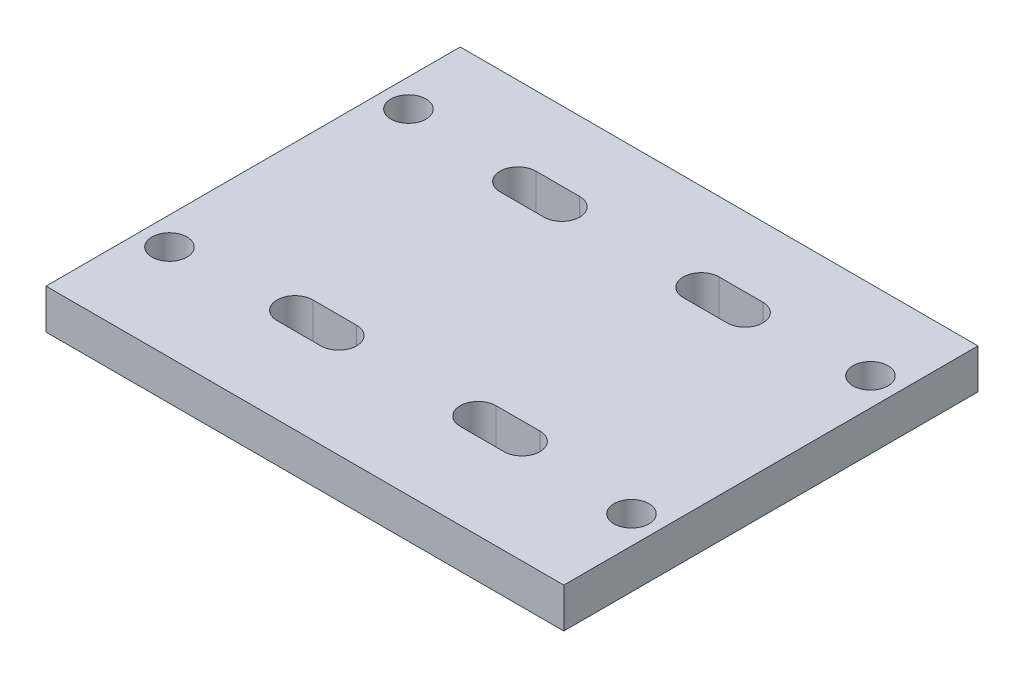
ISO-10303-21;
HEADER;
FILE_DESCRIPTION(('STEP AP214'),'2;1');
FILE_NAME('part.step','',(''),(''),'','','');
FILE_SCHEMA(('AUTOMOTIVE_DESIGN { 1 0 10303 214 1 1 1 1 }'));
ENDSEC;
DATA;
#1=APPLICATION_CONTEXT('core data for automotive mechanical design processes');
#2=APPLICATION_PROTOCOL_DEFINITION('international standard','automotive_design',2000,#1);
#3=PRODUCT_CONTEXT('',#1,'mechanical');
#4=PRODUCT('Part','Part','',(#3));
#5=PRODUCT_RELATED_PRODUCT_CATEGORY('part','',(#4));
#6=PRODUCT_DEFINITION_FORMATION('','',#4);
#7=PRODUCT_DEFINITION_CONTEXT('part definition',#1,'design');
#8=PRODUCT_DEFINITION('design','',#6,#7);
#9=PRODUCT_DEFINITION_SHAPE('','',#8);
#10=(LENGTH_UNIT() NAMED_UNIT(*) SI_UNIT(.MILLI.,.METRE.));
#11=(NAMED_UNIT(*) PLANE_ANGLE_UNIT() SI_UNIT($,.RADIAN.));
#12=(NAMED_UNIT(*) SI_UNIT($,.STERADIAN.) SOLID_ANGLE_UNIT());
#13=UNCERTAINTY_MEASURE_WITH_UNIT(LENGTH_MEASURE(1.E-05),#10,'distance_accuracy_value','');
#14=(GEOMETRIC_REPRESENTATION_CONTEXT(3) GLOBAL_UNCERTAINTY_ASSIGNED_CONTEXT((#13)) GLOBAL_UNIT_ASSIGNED_CONTEXT((#10,
#11,#12)) REPRESENTATION_CONTEXT('',''));
#15=CARTESIAN_POINT('',(0.,0.,0.));
#16=DIRECTION('',(0.,0.,1.));
#17=DIRECTION('',(1.,0.,0.));
#18=AXIS2_PLACEMENT_3D('',#15,#16,#17);
#19=CARTESIAN_POINT('',(0.,5.,0.));
#20=DIRECTION('',(0.,-1.,0.));
#21=DIRECTION('',(0.,0.,-1.));
#22=AXIS2_PLACEMENT_3D('',#19,#20,#21);
#23=PLANE('',#22);
#24=CARTESIAN_POINT('',(8.75,5.,-15.));
#25=DIRECTION('',(0.,1.,0.));
#26=DIRECTION('',(0.,0.,1.));
#27=AXIS2_PLACEMENT_3D('',#24,#25,#26);
#28=CIRCLE('',#27,2.25);
#29=CARTESIAN_POINT('',(8.75,5.,-17.25));
#30=VERTEX_POINT('',#29);
#31=CARTESIAN_POINT('',(8.75,5.,-12.75));
#32=VERTEX_POINT('',#31);
#33=EDGE_CURVE('E209',#30,#32,#28,.T.);
#34=ORIENTED_EDGE('',*,*,#33,.F.);
#35=DIRECTION('',(-1.,0.,0.));
#36=VECTOR('',#35,1.);
#37=CARTESIAN_POINT('',(8.75,5.,-17.25));
#38=LINE('',#37,#36);
#39=CARTESIAN_POINT('',(14.25,5.,-17.25));
#40=VERTEX_POINT('',#39);
#41=EDGE_CURVE('E217',#40,#30,#38,.T.);
#42=ORIENTED_EDGE('',*,*,#41,.F.);
#43=CARTESIAN_POINT('',(14.25,5.,-15.));
#44=DIRECTION('',(0.,1.,0.));
#45=DIRECTION('',(0.,0.,1.));
#46=AXIS2_PLACEMENT_3D('',#43,#44,#45);
#47=CIRCLE('',#46,2.25);
#48=CARTESIAN_POINT('',(14.25,5.,-12.75));
#49=VERTEX_POINT('',#48);
#50=EDGE_CURVE('E214',#49,#40,#47,.T.);
#51=ORIENTED_EDGE('',*,*,#50,.F.);
#52=DIRECTION('',(1.,0.,0.));
#53=VECTOR('',#52,1.);
#54=CARTESIAN_POINT('',(8.75,5.,-12.75));
#55=LINE('',#54,#53);
#56=EDGE_CURVE('E211',#32,#49,#55,.T.);
#57=ORIENTED_EDGE('',*,*,#56,.F.);
#58=EDGE_LOOP('',(#34,#42,#51,#57));
#59=FACE_BOUND('',#58,.T.);
#60=CARTESIAN_POINT('',(-14.25,5.,-15.));
#61=DIRECTION('',(0.,1.,0.));
#62=DIRECTION('',(0.,0.,1.));
#63=AXIS2_PLACEMENT_3D('',#60,#61,#62);
#64=CIRCLE('',#63,2.25);
#65=CARTESIAN_POINT('',(-14.25,5.,-17.25));
#66=VERTEX_POINT('',#65);
#67=CARTESIAN_POINT('',(-14.25,5.,-12.75));
#68=VERTEX_POINT('',#67);
#69=EDGE_CURVE('E271',#66,#68,#64,.T.);
#70=ORIENTED_EDGE('',*,*,#69,.F.);
#71=DIRECTION('',(-1.,0.,0.));
#72=VECTOR('',#71,1.);
#73=CARTESIAN_POINT('',(-14.25,5.,-17.25));
#74=LINE('',#73,#72);
#75=CARTESIAN_POINT('',(-8.75,5.,-17.25));
#76=VERTEX_POINT('',#75);
#77=EDGE_CURVE('E279',#76,#66,#74,.T.);
#78=ORIENTED_EDGE('',*,*,#77,.F.);
#79=CARTESIAN_POINT('',(-8.75,5.,-15.));
#80=DIRECTION('',(0.,1.,0.));
#81=DIRECTION('',(0.,0.,1.));
#82=AXIS2_PLACEMENT_3D('',#79,#80,#81);
#83=CIRCLE('',#82,2.25);
#84=CARTESIAN_POINT('',(-8.75,5.,-12.75));
#85=VERTEX_POINT('',#84);
#86=EDGE_CURVE('E276',#85,#76,#83,.T.);
#87=ORIENTED_EDGE('',*,*,#86,.F.);
#88=DIRECTION('',(1.,0.,0.));
#89=VECTOR('',#88,1.);
#90=CARTESIAN_POINT('',(-14.25,5.,-12.75));
#91=LINE('',#90,#89);
#92=EDGE_CURVE('E273',#68,#85,#91,.T.);
#93=ORIENTED_EDGE('',*,*,#92,.F.);
#94=EDGE_LOOP('',(#70,#78,#87,#93));
#95=FACE_BOUND('',#94,.T.);
#96=DIRECTION('',(0.,0.,-1.));
#97=VECTOR('',#96,1.);
#98=CARTESIAN_POINT('',(32.5,5.,26.));
#99=LINE('',#98,#97);
#100=CARTESIAN_POINT('',(32.5,5.,26.));
#101=VERTEX_POINT('',#100);
#102=CARTESIAN_POINT('',(32.5,5.,-26.));
#103=VERTEX_POINT('',#102);
#104=EDGE_CURVE('E326',#101,#103,#99,.T.);
#105=ORIENTED_EDGE('',*,*,#104,.T.);
#106=DIRECTION('',(-1.,0.,0.));
#107=VECTOR('',#106,1.);
#108=CARTESIAN_POINT('',(-32.5,5.,-26.));
#109=LINE('',#108,#107);
#110=CARTESIAN_POINT('',(-32.5,5.,-26.));
#111=VERTEX_POINT('',#110);
#112=EDGE_CURVE('E329',#103,#111,#109,.T.);
#113=ORIENTED_EDGE('',*,*,#112,.T.);
#114=DIRECTION('',(0.,0.,1.));
#115=VECTOR('',#114,1.);
#116=CARTESIAN_POINT('',(-32.5,5.,26.));
#117=LINE('',#116,#115);
#118=CARTESIAN_POINT('',(-32.5,5.,26.));
#119=VERTEX_POINT('',#118);
#120=EDGE_CURVE('E332',#111,#119,#117,.T.);
#121=ORIENTED_EDGE('',*,*,#120,.T.);
#122=DIRECTION('',(1.,0.,0.));
#123=VECTOR('',#122,1.);
#124=CARTESIAN_POINT('',(-32.5,5.,26.));
#125=LINE('',#124,#123);
#126=EDGE_CURVE('E334',#119,#101,#125,.T.);
#127=ORIENTED_EDGE('',*,*,#126,.T.);
#128=EDGE_LOOP('',(#105,#113,#121,#127));
#129=FACE_BOUND('',#128,.T.);
#130=CARTESIAN_POINT('',(-29.,5.,-16.));
#131=DIRECTION('',(0.,1.,0.));
#132=DIRECTION('',(0.,0.,1.));
#133=AXIS2_PLACEMENT_3D('',#130,#131,#132);
#134=CIRCLE('',#133,2.2);
#135=CARTESIAN_POINT('',(-29.,5.,-13.8));
#136=VERTEX_POINT('',#135);
#137=EDGE_CURVE('E320',#136,#136,#134,.T.);
#138=ORIENTED_EDGE('',*,*,#137,.F.);
#139=EDGE_LOOP('',(#138));
#140=FACE_BOUND('',#139,.T.);
#141=CARTESIAN_POINT('',(-29.,5.,14.));
#142=DIRECTION('',(0.,1.,0.));
#143=DIRECTION('',(0.,0.,1.));
#144=AXIS2_PLACEMENT_3D('',#141,#142,#143);
#145=CIRCLE('',#144,2.2);
#146=CARTESIAN_POINT('',(-29.,5.,16.2));
#147=VERTEX_POINT('',#146);
#148=EDGE_CURVE('E314',#147,#147,#145,.T.);
#149=ORIENTED_EDGE('',*,*,#148,.F.);
#150=EDGE_LOOP('',(#149));
#151=FACE_BOUND('',#150,.T.);
#152=CARTESIAN_POINT('',(29.,5.,14.));
#153=DIRECTION('',(0.,1.,0.));
#154=DIRECTION('',(0.,0.,1.));
#155=AXIS2_PLACEMENT_3D('',#152,#153,#154);
#156=CIRCLE('',#155,2.2);
#157=CARTESIAN_POINT('',(29.,5.,16.2));
#158=VERTEX_POINT('',#157);
#159=EDGE_CURVE('E308',#158,#158,#156,.T.);
#160=ORIENTED_EDGE('',*,*,#159,.F.);
#161=EDGE_LOOP('',(#160));
#162=FACE_BOUND('',#161,.T.);
#163=CARTESIAN_POINT('',(29.,5.,-16.));
#164=DIRECTION('',(0.,1.,0.));
#165=DIRECTION('',(0.,0.,1.));
#166=AXIS2_PLACEMENT_3D('',#163,#164,#165);
#167=CIRCLE('',#166,2.2);
#168=CARTESIAN_POINT('',(29.,5.,-13.8));
#169=VERTEX_POINT('',#168);
#170=EDGE_CURVE('E302',#169,#169,#167,.T.);
#171=ORIENTED_EDGE('',*,*,#170,.F.);
#172=EDGE_LOOP('',(#171));
#173=FACE_BOUND('',#172,.T.);
#174=CARTESIAN_POINT('',(8.75000000000001,5.,13.));
#175=DIRECTION('',(0.,1.,0.));
#176=DIRECTION('',(0.,0.,1.));
#177=AXIS2_PLACEMENT_3D('',#174,#175,#176);
#178=CIRCLE('',#177,2.25);
#179=CARTESIAN_POINT('',(8.75000000000001,5.,10.75));
#180=VERTEX_POINT('',#179);
#181=CARTESIAN_POINT('',(8.75000000000001,5.,15.25));
#182=VERTEX_POINT('',#181);
#183=EDGE_CURVE('E240',#180,#182,#178,.T.);
#184=ORIENTED_EDGE('',*,*,#183,.F.);
#185=DIRECTION('',(-1.,0.,0.));
#186=VECTOR('',#185,1.);
#187=CARTESIAN_POINT('',(8.75000000000001,5.,10.75));
#188=LINE('',#187,#186);
#189=CARTESIAN_POINT('',(14.25,5.,10.75));
#190=VERTEX_POINT('',#189);
#191=EDGE_CURVE('E248',#190,#180,#188,.T.);
#192=ORIENTED_EDGE('',*,*,#191,.F.);
#193=CARTESIAN_POINT('',(14.25,5.,13.));
#194=DIRECTION('',(0.,1.,0.));
#195=DIRECTION('',(0.,0.,1.));
#196=AXIS2_PLACEMENT_3D('',#193,#194,#195);
#197=CIRCLE('',#196,2.25);
#198=CARTESIAN_POINT('',(14.25,5.,15.25));
#199=VERTEX_POINT('',#198);
#200=EDGE_CURVE('E245',#199,#190,#197,.T.);
#201=ORIENTED_EDGE('',*,*,#200,.F.);
#202=DIRECTION('',(1.,0.,0.));
#203=VECTOR('',#202,1.);
#204=CARTESIAN_POINT('',(8.75000000000001,5.,15.25));
#205=LINE('',#204,#203);
#206=EDGE_CURVE('E242',#182,#199,#205,.T.);
#207=ORIENTED_EDGE('',*,*,#206,.F.);
#208=EDGE_LOOP('',(#184,#192,#201,#207));
#209=FACE_BOUND('',#208,.T.);
#210=CARTESIAN_POINT('',(-14.25,5.,13.));
#211=DIRECTION('',(0.,1.,0.));
#212=DIRECTION('',(0.,0.,1.));
#213=AXIS2_PLACEMENT_3D('',#210,#211,#212);
#214=CIRCLE('',#213,2.25);
#215=CARTESIAN_POINT('',(-14.25,5.,10.75));
#216=VERTEX_POINT('',#215);
#217=CARTESIAN_POINT('',(-14.25,5.,15.25));
#218=VERTEX_POINT('',#217);
#219=EDGE_CURVE('E173',#216,#218,#214,.T.);
#220=ORIENTED_EDGE('',*,*,#219,.F.);
#221=DIRECTION('',(-1.,0.,0.));
#222=VECTOR('',#221,1.);
#223=CARTESIAN_POINT('',(-14.25,5.,10.75));
#224=LINE('',#223,#222);
#225=CARTESIAN_POINT('',(-8.75,5.,10.75));
#226=VERTEX_POINT('',#225);
#227=EDGE_CURVE('E195',#226,#216,#224,.T.);
#228=ORIENTED_EDGE('',*,*,#227,.F.);
#229=CARTESIAN_POINT('',(-8.75,5.,13.));
#230=DIRECTION('',(0.,1.,0.));
#231=DIRECTION('',(0.,0.,1.));
#232=AXIS2_PLACEMENT_3D('',#229,#230,#231);
#233=CIRCLE('',#232,2.25);
#234=CARTESIAN_POINT('',(-8.74999999999999,5.,15.25));
#235=VERTEX_POINT('',#234);
#236=EDGE_CURVE('E193',#235,#226,#233,.T.);
#237=ORIENTED_EDGE('',*,*,#236,.F.);
#238=DIRECTION('',(1.,0.,0.));
#239=VECTOR('',#238,1.);
#240=CARTESIAN_POINT('',(-14.25,5.,15.25));
#241=LINE('',#240,#239);
#242=EDGE_CURVE('E181',#218,#235,#241,.T.);
#243=ORIENTED_EDGE('',*,*,#242,.F.);
#244=EDGE_LOOP('',(#220,#228,#237,#243));
#245=FACE_BOUND('',#244,.T.);
#246=ADVANCED_FACE('F36',(#59,#95,#129,#140,#151,#162,#173,#209,#245),#23,.F.);
#247=CARTESIAN_POINT('',(0.,0.,0.));
#248=DIRECTION('',(0.,-1.,0.));
#249=DIRECTION('',(0.,0.,-1.));
#250=AXIS2_PLACEMENT_3D('',#247,#248,#249);
#251=PLANE('',#250);
#252=CARTESIAN_POINT('',(29.,0.,14.));
#253=DIRECTION('',(0.,1.,0.));
#254=DIRECTION('',(0.,0.,1.));
#255=AXIS2_PLACEMENT_3D('',#252,#253,#254);
#256=CIRCLE('',#255,2.2);
#257=CARTESIAN_POINT('',(29.,0.,16.2));
#258=VERTEX_POINT('',#257);
#259=EDGE_CURVE('E305',#258,#258,#256,.T.);
#260=ORIENTED_EDGE('',*,*,#259,.T.);
#261=EDGE_LOOP('',(#260));
#262=FACE_BOUND('',#261,.T.);
#263=CARTESIAN_POINT('',(-29.,0.,-16.));
#264=DIRECTION('',(0.,1.,0.));
#265=DIRECTION('',(0.,0.,1.));
#266=AXIS2_PLACEMENT_3D('',#263,#264,#265);
#267=CIRCLE('',#266,2.2);
#268=CARTESIAN_POINT('',(-29.,0.,-13.8));
#269=VERTEX_POINT('',#268);
#270=EDGE_CURVE('E317',#269,#269,#267,.T.);
#271=ORIENTED_EDGE('',*,*,#270,.T.);
#272=EDGE_LOOP('',(#271));
#273=FACE_BOUND('',#272,.T.);
#274=DIRECTION('',(0.,0.,-1.));
#275=VECTOR('',#274,1.);
#276=CARTESIAN_POINT('',(32.5,0.,26.));
#277=LINE('',#276,#275);
#278=CARTESIAN_POINT('',(32.5,0.,26.));
#279=VERTEX_POINT('',#278);
#280=CARTESIAN_POINT('',(32.5,0.,-26.));
#281=VERTEX_POINT('',#280);
#282=EDGE_CURVE('E323',#279,#281,#277,.T.);
#283=ORIENTED_EDGE('',*,*,#282,.F.);
#284=DIRECTION('',(1.,0.,0.));
#285=VECTOR('',#284,1.);
#286=CARTESIAN_POINT('',(-32.5,0.,26.));
#287=LINE('',#286,#285);
#288=CARTESIAN_POINT('',(-32.5,0.,26.));
#289=VERTEX_POINT('',#288);
#290=EDGE_CURVE('E330',#289,#279,#287,.T.);
#291=ORIENTED_EDGE('',*,*,#290,.F.);
#292=DIRECTION('',(0.,0.,1.));
#293=VECTOR('',#292,1.);
#294=CARTESIAN_POINT('',(-32.5,0.,26.));
#295=LINE('',#294,#293);
#296=CARTESIAN_POINT('',(-32.5,0.,-26.));
#297=VERTEX_POINT('',#296);
#298=EDGE_CURVE('E341',#297,#289,#295,.T.);
#299=ORIENTED_EDGE('',*,*,#298,.F.);
#300=DIRECTION('',(-1.,0.,0.));
#301=VECTOR('',#300,1.);
#302=CARTESIAN_POINT('',(-32.5,0.,-26.));
#303=LINE('',#302,#301);
#304=EDGE_CURVE('E339',#281,#297,#303,.T.);
#305=ORIENTED_EDGE('',*,*,#304,.F.);
#306=EDGE_LOOP('',(#283,#291,#299,#305));
#307=FACE_BOUND('',#306,.T.);
#308=CARTESIAN_POINT('',(-29.,0.,14.));
#309=DIRECTION('',(0.,1.,0.));
#310=DIRECTION('',(0.,0.,1.));
#311=AXIS2_PLACEMENT_3D('',#308,#309,#310);
#312=CIRCLE('',#311,2.2);
#313=CARTESIAN_POINT('',(-29.,0.,16.2));
#314=VERTEX_POINT('',#313);
#315=EDGE_CURVE('E311',#314,#314,#312,.T.);
#316=ORIENTED_EDGE('',*,*,#315,.T.);
#317=EDGE_LOOP('',(#316));
#318=FACE_BOUND('',#317,.T.);
#319=CARTESIAN_POINT('',(29.,0.,-16.));
#320=DIRECTION('',(0.,1.,0.));
#321=DIRECTION('',(0.,0.,1.));
#322=AXIS2_PLACEMENT_3D('',#319,#320,#321);
#323=CIRCLE('',#322,2.2);
#324=CARTESIAN_POINT('',(29.,0.,-13.8));
#325=VERTEX_POINT('',#324);
#326=EDGE_CURVE('E301',#325,#325,#323,.T.);
#327=ORIENTED_EDGE('',*,*,#326,.T.);
#328=EDGE_LOOP('',(#327));
#329=FACE_BOUND('',#328,.T.);
#330=DIRECTION('',(-1.,0.,0.));
#331=VECTOR('',#330,1.);
#332=CARTESIAN_POINT('',(-14.25,0.,-17.25));
#333=LINE('',#332,#331);
#334=CARTESIAN_POINT('',(-8.75,0.,-17.25));
#335=VERTEX_POINT('',#334);
#336=CARTESIAN_POINT('',(-14.25,0.,-17.25));
#337=VERTEX_POINT('',#336);
#338=EDGE_CURVE('E274',#335,#337,#333,.T.);
#339=ORIENTED_EDGE('',*,*,#338,.T.);
#340=CARTESIAN_POINT('',(-14.25,0.,-15.));
#341=DIRECTION('',(0.,1.,0.));
#342=DIRECTION('',(0.,0.,1.));
#343=AXIS2_PLACEMENT_3D('',#340,#341,#342);
#344=CIRCLE('',#343,2.25);
#345=CARTESIAN_POINT('',(-14.25,0.,-12.75));
#346=VERTEX_POINT('',#345);
#347=EDGE_CURVE('E270',#337,#346,#344,.T.);
#348=ORIENTED_EDGE('',*,*,#347,.T.);
#349=DIRECTION('',(1.,0.,0.));
#350=VECTOR('',#349,1.);
#351=CARTESIAN_POINT('',(-14.25,0.,-12.75));
#352=LINE('',#351,#350);
#353=CARTESIAN_POINT('',(-8.75,0.,-12.75));
#354=VERTEX_POINT('',#353);
#355=EDGE_CURVE('E284',#346,#354,#352,.T.);
#356=ORIENTED_EDGE('',*,*,#355,.T.);
#357=CARTESIAN_POINT('',(-8.75,0.,-15.));
#358=DIRECTION('',(0.,1.,0.));
#359=DIRECTION('',(0.,0.,1.));
#360=AXIS2_PLACEMENT_3D('',#357,#358,#359);
#361=CIRCLE('',#360,2.25);
#362=EDGE_CURVE('E287',#354,#335,#361,.T.);
#363=ORIENTED_EDGE('',*,*,#362,.T.);
#364=EDGE_LOOP('',(#339,#348,#356,#363));
#365=FACE_BOUND('',#364,.T.);
#366=DIRECTION('',(-1.,0.,0.));
#367=VECTOR('',#366,1.);
#368=CARTESIAN_POINT('',(8.75000000000001,0.,10.75));
#369=LINE('',#368,#367);
#370=CARTESIAN_POINT('',(14.25,0.,10.75));
#371=VERTEX_POINT('',#370);
#372=CARTESIAN_POINT('',(8.75000000000001,0.,10.75));
#373=VERTEX_POINT('',#372);
#374=EDGE_CURVE('E243',#371,#373,#369,.T.);
#375=ORIENTED_EDGE('',*,*,#374,.T.);
#376=CARTESIAN_POINT('',(8.75000000000001,0.,13.));
#377=DIRECTION('',(0.,1.,0.));
#378=DIRECTION('',(0.,0.,1.));
#379=AXIS2_PLACEMENT_3D('',#376,#377,#378);
#380=CIRCLE('',#379,2.25);
#381=CARTESIAN_POINT('',(8.75000000000001,0.,15.25));
#382=VERTEX_POINT('',#381);
#383=EDGE_CURVE('E239',#373,#382,#380,.T.);
#384=ORIENTED_EDGE('',*,*,#383,.T.);
#385=DIRECTION('',(1.,0.,0.));
#386=VECTOR('',#385,1.);
#387=CARTESIAN_POINT('',(8.75000000000001,0.,15.25));
#388=LINE('',#387,#386);
#389=CARTESIAN_POINT('',(14.25,0.,15.25));
#390=VERTEX_POINT('',#389);
#391=EDGE_CURVE('E253',#382,#390,#388,.T.);
#392=ORIENTED_EDGE('',*,*,#391,.T.);
#393=CARTESIAN_POINT('',(14.25,0.,13.));
#394=DIRECTION('',(0.,1.,0.));
#395=DIRECTION('',(0.,0.,1.));
#396=AXIS2_PLACEMENT_3D('',#393,#394,#395);
#397=CIRCLE('',#396,2.25);
#398=EDGE_CURVE('E256',#390,#371,#397,.T.);
#399=ORIENTED_EDGE('',*,*,#398,.T.);
#400=EDGE_LOOP('',(#375,#384,#392,#399));
#401=FACE_BOUND('',#400,.T.);
#402=DIRECTION('',(-1.,0.,0.));
#403=VECTOR('',#402,1.);
#404=CARTESIAN_POINT('',(8.75,0.,-17.25));
#405=LINE('',#404,#403);
#406=CARTESIAN_POINT('',(14.25,0.,-17.25));
#407=VERTEX_POINT('',#406);
#408=CARTESIAN_POINT('',(8.75,0.,-17.25));
#409=VERTEX_POINT('',#408);
#410=EDGE_CURVE('E212',#407,#409,#405,.T.);
#411=ORIENTED_EDGE('',*,*,#410,.T.);
#412=CARTESIAN_POINT('',(8.75,0.,-15.));
#413=DIRECTION('',(0.,1.,0.));
#414=DIRECTION('',(0.,0.,1.));
#415=AXIS2_PLACEMENT_3D('',#412,#413,#414);
#416=CIRCLE('',#415,2.25);
#417=CARTESIAN_POINT('',(8.75,0.,-12.75));
#418=VERTEX_POINT('',#417);
#419=EDGE_CURVE('E189',#409,#418,#416,.T.);
#420=ORIENTED_EDGE('',*,*,#419,.T.);
#421=DIRECTION('',(1.,0.,0.));
#422=VECTOR('',#421,1.);
#423=CARTESIAN_POINT('',(8.75,0.,-12.75));
#424=LINE('',#423,#422);
#425=CARTESIAN_POINT('',(14.25,0.,-12.75));
#426=VERTEX_POINT('',#425);
#427=EDGE_CURVE('E222',#418,#426,#424,.T.);
#428=ORIENTED_EDGE('',*,*,#427,.T.);
#429=CARTESIAN_POINT('',(14.25,0.,-15.));
#430=DIRECTION('',(0.,1.,0.));
#431=DIRECTION('',(0.,0.,1.));
#432=AXIS2_PLACEMENT_3D('',#429,#430,#431);
#433=CIRCLE('',#432,2.25);
#434=EDGE_CURVE('E225',#426,#407,#433,.T.);
#435=ORIENTED_EDGE('',*,*,#434,.T.);
#436=EDGE_LOOP('',(#411,#420,#428,#435));
#437=FACE_BOUND('',#436,.T.);
#438=DIRECTION('',(-1.,0.,0.));
#439=VECTOR('',#438,1.);
#440=CARTESIAN_POINT('',(-14.25,0.,10.75));
#441=LINE('',#440,#439);
#442=CARTESIAN_POINT('',(-8.75,0.,10.75));
#443=VERTEX_POINT('',#442);
#444=CARTESIAN_POINT('',(-14.25,0.,10.75));
#445=VERTEX_POINT('',#444);
#446=EDGE_CURVE('E182',#443,#445,#441,.T.);
#447=ORIENTED_EDGE('',*,*,#446,.T.);
#448=CARTESIAN_POINT('',(-14.25,0.,13.));
#449=DIRECTION('',(0.,1.,0.));
#450=DIRECTION('',(0.,0.,1.));
#451=AXIS2_PLACEMENT_3D('',#448,#449,#450);
#452=CIRCLE('',#451,2.25);
#453=CARTESIAN_POINT('',(-14.25,0.,15.25));
#454=VERTEX_POINT('',#453);
#455=EDGE_CURVE('E59',#445,#454,#452,.T.);
#456=ORIENTED_EDGE('',*,*,#455,.T.);
#457=DIRECTION('',(1.,0.,0.));
#458=VECTOR('',#457,1.);
#459=CARTESIAN_POINT('',(-14.25,0.,15.25));
#460=LINE('',#459,#458);
#461=CARTESIAN_POINT('',(-8.74999999999999,0.,15.25));
#462=VERTEX_POINT('',#461);
#463=EDGE_CURVE('E188',#454,#462,#460,.T.);
#464=ORIENTED_EDGE('',*,*,#463,.T.);
#465=CARTESIAN_POINT('',(-8.75,0.,13.));
#466=DIRECTION('',(0.,1.,0.));
#467=DIRECTION('',(0.,0.,1.));
#468=AXIS2_PLACEMENT_3D('',#465,#466,#467);
#469=CIRCLE('',#468,2.25);
#470=EDGE_CURVE('E201',#462,#443,#469,.T.);
#471=ORIENTED_EDGE('',*,*,#470,.T.);
#472=EDGE_LOOP('',(#447,#456,#464,#471));
#473=FACE_BOUND('',#472,.T.);
#474=ADVANCED_FACE('F359',(#262,#273,#307,#318,#329,#365,#401,#437,#473),#251,.T.);
#475=CARTESIAN_POINT('',(32.5,5.,26.));
#476=DIRECTION('',(-1.,0.,0.));
#477=DIRECTION('',(0.,0.,1.));
#478=AXIS2_PLACEMENT_3D('',#475,#476,#477);
#479=PLANE('',#478);
#480=ORIENTED_EDGE('',*,*,#282,.T.);
#481=DIRECTION('',(0.,-1.,0.));
#482=VECTOR('',#481,1.);
#483=CARTESIAN_POINT('',(32.5,5.,-26.));
#484=LINE('',#483,#482);
#485=EDGE_CURVE('E11',#103,#281,#484,.T.);
#486=ORIENTED_EDGE('',*,*,#485,.F.);
#487=ORIENTED_EDGE('',*,*,#104,.F.);
#488=DIRECTION('',(0.,-1.,0.));
#489=VECTOR('',#488,1.);
#490=CARTESIAN_POINT('',(32.5,5.,26.));
#491=LINE('',#490,#489);
#492=EDGE_CURVE('E336',#101,#279,#491,.T.);
#493=ORIENTED_EDGE('',*,*,#492,.T.);
#494=EDGE_LOOP('',(#480,#486,#487,#493));
#495=FACE_BOUND('',#494,.T.);
#496=ADVANCED_FACE('F38',(#495),#479,.F.);
#497=CARTESIAN_POINT('',(-32.5,5.,-26.));
#498=DIRECTION('',(0.,0.,1.));
#499=DIRECTION('',(1.,0.,0.));
#500=AXIS2_PLACEMENT_3D('',#497,#498,#499);
#501=PLANE('',#500);
#502=ORIENTED_EDGE('',*,*,#304,.T.);
#503=DIRECTION('',(0.,-1.,0.));
#504=VECTOR('',#503,1.);
#505=CARTESIAN_POINT('',(-32.5,5.,-26.));
#506=LINE('',#505,#504);
#507=EDGE_CURVE('E44',#111,#297,#506,.T.);
#508=ORIENTED_EDGE('',*,*,#507,.F.);
#509=ORIENTED_EDGE('',*,*,#112,.F.);
#510=ORIENTED_EDGE('',*,*,#485,.T.);
#511=EDGE_LOOP('',(#502,#508,#509,#510));
#512=FACE_BOUND('',#511,.T.);
#513=ADVANCED_FACE('F370',(#512),#501,.F.);
#514=CARTESIAN_POINT('',(-32.5,5.,26.));
#515=DIRECTION('',(1.,0.,0.));
#516=DIRECTION('',(0.,0.,-1.));
#517=AXIS2_PLACEMENT_3D('',#514,#515,#516);
#518=PLANE('',#517);
#519=ORIENTED_EDGE('',*,*,#298,.T.);
#520=DIRECTION('',(0.,-1.,0.));
#521=VECTOR('',#520,1.);
#522=CARTESIAN_POINT('',(-32.5,5.,26.));
#523=LINE('',#522,#521);
#524=EDGE_CURVE('E346',#119,#289,#523,.T.);
#525=ORIENTED_EDGE('',*,*,#524,.F.);
#526=ORIENTED_EDGE('',*,*,#120,.F.);
#527=ORIENTED_EDGE('',*,*,#507,.T.);
#528=EDGE_LOOP('',(#519,#525,#526,#527));
#529=FACE_BOUND('',#528,.T.);
#530=ADVANCED_FACE('F353',(#529),#518,.F.);
#531=CARTESIAN_POINT('',(-32.5,5.,26.));
#532=DIRECTION('',(0.,0.,-1.));
#533=DIRECTION('',(-1.,0.,0.));
#534=AXIS2_PLACEMENT_3D('',#531,#532,#533);
#535=PLANE('',#534);
#536=ORIENTED_EDGE('',*,*,#290,.T.);
#537=ORIENTED_EDGE('',*,*,#492,.F.);
#538=ORIENTED_EDGE('',*,*,#126,.F.);
#539=ORIENTED_EDGE('',*,*,#524,.T.);
#540=EDGE_LOOP('',(#536,#537,#538,#539));
#541=FACE_BOUND('',#540,.T.);
#542=ADVANCED_FACE('F363',(#541),#535,.F.);
#543=CARTESIAN_POINT('',(-29.,5.,-16.));
#544=DIRECTION('',(0.,-1.,0.));
#545=DIRECTION('',(0.,0.,-1.));
#546=AXIS2_PLACEMENT_3D('',#543,#544,#545);
#547=CYLINDRICAL_SURFACE('',#546,2.2);
#548=ORIENTED_EDGE('',*,*,#137,.T.);
#549=EDGE_LOOP('',(#548));
#550=FACE_BOUND('',#549,.T.);
#551=ORIENTED_EDGE('',*,*,#270,.F.);
#552=EDGE_LOOP('',(#551));
#553=FACE_BOUND('',#552,.T.);
#554=ADVANCED_FACE('F388',(#550,#553),#547,.F.);
#555=CARTESIAN_POINT('',(-29.,5.,14.));
#556=DIRECTION('',(0.,-1.,0.));
#557=DIRECTION('',(0.,0.,-1.));
#558=AXIS2_PLACEMENT_3D('',#555,#556,#557);
#559=CYLINDRICAL_SURFACE('',#558,2.2);
#560=ORIENTED_EDGE('',*,*,#148,.T.);
#561=EDGE_LOOP('',(#560));
#562=FACE_BOUND('',#561,.T.);
#563=ORIENTED_EDGE('',*,*,#315,.F.);
#564=EDGE_LOOP('',(#563));
#565=FACE_BOUND('',#564,.T.);
#566=ADVANCED_FACE('F395',(#562,#565),#559,.F.);
#567=CARTESIAN_POINT('',(29.,5.,14.));
#568=DIRECTION('',(0.,-1.,0.));
#569=DIRECTION('',(0.,0.,-1.));
#570=AXIS2_PLACEMENT_3D('',#567,#568,#569);
#571=CYLINDRICAL_SURFACE('',#570,2.2);
#572=ORIENTED_EDGE('',*,*,#159,.T.);
#573=EDGE_LOOP('',(#572));
#574=FACE_BOUND('',#573,.T.);
#575=ORIENTED_EDGE('',*,*,#259,.F.);
#576=EDGE_LOOP('',(#575));
#577=FACE_BOUND('',#576,.T.);
#578=ADVANCED_FACE('F400',(#574,#577),#571,.F.);
#579=CARTESIAN_POINT('',(29.,5.,-16.));
#580=DIRECTION('',(0.,-1.,0.));
#581=DIRECTION('',(0.,0.,-1.));
#582=AXIS2_PLACEMENT_3D('',#579,#580,#581);
#583=CYLINDRICAL_SURFACE('',#582,2.2);
#584=ORIENTED_EDGE('',*,*,#170,.T.);
#585=EDGE_LOOP('',(#584));
#586=FACE_BOUND('',#585,.T.);
#587=ORIENTED_EDGE('',*,*,#326,.F.);
#588=EDGE_LOOP('',(#587));
#589=FACE_BOUND('',#588,.T.);
#590=ADVANCED_FACE('F460',(#586,#589),#583,.F.);
#591=CARTESIAN_POINT('',(-14.25,5.,-15.));
#592=DIRECTION('',(0.,-1.,0.));
#593=DIRECTION('',(0.,0.,-1.));
#594=AXIS2_PLACEMENT_3D('',#591,#592,#593);
#595=CYLINDRICAL_SURFACE('',#594,2.25);
#596=ORIENTED_EDGE('',*,*,#347,.F.);
#597=DIRECTION('',(0.,-1.,0.));
#598=VECTOR('',#597,1.);
#599=CARTESIAN_POINT('',(-14.25,5.,-17.25));
#600=LINE('',#599,#598);
#601=EDGE_CURVE('E281',#66,#337,#600,.T.);
#602=ORIENTED_EDGE('',*,*,#601,.F.);
#603=ORIENTED_EDGE('',*,*,#69,.T.);
#604=DIRECTION('',(0.,-1.,0.));
#605=VECTOR('',#604,1.);
#606=CARTESIAN_POINT('',(-14.25,5.,-12.75));
#607=LINE('',#606,#605);
#608=EDGE_CURVE('E298',#68,#346,#607,.T.);
#609=ORIENTED_EDGE('',*,*,#608,.T.);
#610=EDGE_LOOP('',(#596,#602,#603,#609));
#611=FACE_BOUND('',#610,.T.);
#612=ADVANCED_FACE('F456',(#611),#595,.F.);
#613=CARTESIAN_POINT('',(-14.25,5.,-12.75));
#614=DIRECTION('',(0.,0.,-1.));
#615=DIRECTION('',(-1.,0.,0.));
#616=AXIS2_PLACEMENT_3D('',#613,#614,#615);
#617=PLANE('',#616);
#618=ORIENTED_EDGE('',*,*,#355,.F.);
#619=ORIENTED_EDGE('',*,*,#608,.F.);
#620=ORIENTED_EDGE('',*,*,#92,.T.);
#621=DIRECTION('',(0.,-1.,0.));
#622=VECTOR('',#621,1.);
#623=CARTESIAN_POINT('',(-8.75,5.,-12.75));
#624=LINE('',#623,#622);
#625=EDGE_CURVE('E296',#85,#354,#624,.T.);
#626=ORIENTED_EDGE('',*,*,#625,.T.);
#627=EDGE_LOOP('',(#618,#619,#620,#626));
#628=FACE_BOUND('',#627,.T.);
#629=ADVANCED_FACE('F452',(#628),#617,.T.);
#630=CARTESIAN_POINT('',(-8.75,5.,-15.));
#631=DIRECTION('',(0.,-1.,0.));
#632=DIRECTION('',(0.,0.,-1.));
#633=AXIS2_PLACEMENT_3D('',#630,#631,#632);
#634=CYLINDRICAL_SURFACE('',#633,2.25);
#635=ORIENTED_EDGE('',*,*,#362,.F.);
#636=ORIENTED_EDGE('',*,*,#625,.F.);
#637=ORIENTED_EDGE('',*,*,#86,.T.);
#638=DIRECTION('',(0.,-1.,0.));
#639=VECTOR('',#638,1.);
#640=CARTESIAN_POINT('',(-8.75,5.,-17.25));
#641=LINE('',#640,#639);
#642=EDGE_CURVE('E294',#76,#335,#641,.T.);
#643=ORIENTED_EDGE('',*,*,#642,.T.);
#644=EDGE_LOOP('',(#635,#636,#637,#643));
#645=FACE_BOUND('',#644,.T.);
#646=ADVANCED_FACE('F448',(#645),#634,.F.);
#647=CARTESIAN_POINT('',(-14.25,5.,-17.25));
#648=DIRECTION('',(0.,0.,1.));
#649=DIRECTION('',(1.,0.,0.));
#650=AXIS2_PLACEMENT_3D('',#647,#648,#649);
#651=PLANE('',#650);
#652=ORIENTED_EDGE('',*,*,#338,.F.);
#653=ORIENTED_EDGE('',*,*,#642,.F.);
#654=ORIENTED_EDGE('',*,*,#77,.T.);
#655=ORIENTED_EDGE('',*,*,#601,.T.);
#656=EDGE_LOOP('',(#652,#653,#654,#655));
#657=FACE_BOUND('',#656,.T.);
#658=ADVANCED_FACE('F445',(#657),#651,.T.);
#659=CARTESIAN_POINT('',(8.75000000000001,5.,13.));
#660=DIRECTION('',(0.,-1.,0.));
#661=DIRECTION('',(0.,0.,-1.));
#662=AXIS2_PLACEMENT_3D('',#659,#660,#661);
#663=CYLINDRICAL_SURFACE('',#662,2.25);
#664=ORIENTED_EDGE('',*,*,#383,.F.);
#665=DIRECTION('',(0.,-1.,0.));
#666=VECTOR('',#665,1.);
#667=CARTESIAN_POINT('',(8.75000000000001,5.,10.75));
#668=LINE('',#667,#666);
#669=EDGE_CURVE('E250',#180,#373,#668,.T.);
#670=ORIENTED_EDGE('',*,*,#669,.F.);
#671=ORIENTED_EDGE('',*,*,#183,.T.);
#672=DIRECTION('',(0.,-1.,0.));
#673=VECTOR('',#672,1.);
#674=CARTESIAN_POINT('',(8.75000000000001,5.,15.25));
#675=LINE('',#674,#673);
#676=EDGE_CURVE('E267',#182,#382,#675,.T.);
#677=ORIENTED_EDGE('',*,*,#676,.T.);
#678=EDGE_LOOP('',(#664,#670,#671,#677));
#679=FACE_BOUND('',#678,.T.);
#680=ADVANCED_FACE('F420',(#679),#663,.F.);
#681=CARTESIAN_POINT('',(8.75000000000001,5.,15.25));
#682=DIRECTION('',(0.,0.,-1.));
#683=DIRECTION('',(-1.,0.,0.));
#684=AXIS2_PLACEMENT_3D('',#681,#682,#683);
#685=PLANE('',#684);
#686=ORIENTED_EDGE('',*,*,#391,.F.);
#687=ORIENTED_EDGE('',*,*,#676,.F.);
#688=ORIENTED_EDGE('',*,*,#206,.T.);
#689=DIRECTION('',(0.,-1.,0.));
#690=VECTOR('',#689,1.);
#691=CARTESIAN_POINT('',(14.25,5.,15.25));
#692=LINE('',#691,#690);
#693=EDGE_CURVE('E265',#199,#390,#692,.T.);
#694=ORIENTED_EDGE('',*,*,#693,.T.);
#695=EDGE_LOOP('',(#686,#687,#688,#694));
#696=FACE_BOUND('',#695,.T.);
#697=ADVANCED_FACE('F422',(#696),#685,.T.);
#698=CARTESIAN_POINT('',(14.25,5.,13.));
#699=DIRECTION('',(0.,-1.,0.));
#700=DIRECTION('',(0.,0.,-1.));
#701=AXIS2_PLACEMENT_3D('',#698,#699,#700);
#702=CYLINDRICAL_SURFACE('',#701,2.25);
#703=ORIENTED_EDGE('',*,*,#398,.F.);
#704=ORIENTED_EDGE('',*,*,#693,.F.);
#705=ORIENTED_EDGE('',*,*,#200,.T.);
#706=DIRECTION('',(0.,-1.,0.));
#707=VECTOR('',#706,1.);
#708=CARTESIAN_POINT('',(14.25,5.,10.75));
#709=LINE('',#708,#707);
#710=EDGE_CURVE('E263',#190,#371,#709,.T.);
#711=ORIENTED_EDGE('',*,*,#710,.T.);
#712=EDGE_LOOP('',(#703,#704,#705,#711));
#713=FACE_BOUND('',#712,.T.);
#714=ADVANCED_FACE('F431',(#713),#702,.F.);
#715=CARTESIAN_POINT('',(8.75000000000001,5.,10.75));
#716=DIRECTION('',(0.,0.,1.));
#717=DIRECTION('',(1.,0.,0.));
#718=AXIS2_PLACEMENT_3D('',#715,#716,#717);
#719=PLANE('',#718);
#720=ORIENTED_EDGE('',*,*,#374,.F.);
#721=ORIENTED_EDGE('',*,*,#710,.F.);
#722=ORIENTED_EDGE('',*,*,#191,.T.);
#723=ORIENTED_EDGE('',*,*,#669,.T.);
#724=EDGE_LOOP('',(#720,#721,#722,#723));
#725=FACE_BOUND('',#724,.T.);
#726=ADVANCED_FACE('F429',(#725),#719,.T.);
#727=CARTESIAN_POINT('',(8.75,5.,-15.));
#728=DIRECTION('',(0.,-1.,0.));
#729=DIRECTION('',(0.,0.,-1.));
#730=AXIS2_PLACEMENT_3D('',#727,#728,#729);
#731=CYLINDRICAL_SURFACE('',#730,2.25);
#732=ORIENTED_EDGE('',*,*,#419,.F.);
#733=DIRECTION('',(0.,-1.,0.));
#734=VECTOR('',#733,1.);
#735=CARTESIAN_POINT('',(8.75,5.,-17.25));
#736=LINE('',#735,#734);
#737=EDGE_CURVE('E219',#30,#409,#736,.T.);
#738=ORIENTED_EDGE('',*,*,#737,.F.);
#739=ORIENTED_EDGE('',*,*,#33,.T.);
#740=DIRECTION('',(0.,-1.,0.));
#741=VECTOR('',#740,1.);
#742=CARTESIAN_POINT('',(8.75,5.,-12.75));
#743=LINE('',#742,#741);
#744=EDGE_CURVE('E236',#32,#418,#743,.T.);
#745=ORIENTED_EDGE('',*,*,#744,.T.);
#746=EDGE_LOOP('',(#732,#738,#739,#745));
#747=FACE_BOUND('',#746,.T.);
#748=ADVANCED_FACE('F438',(#747),#731,.F.);
#749=CARTESIAN_POINT('',(8.75,5.,-12.75));
#750=DIRECTION('',(0.,0.,-1.));
#751=DIRECTION('',(-1.,0.,0.));
#752=AXIS2_PLACEMENT_3D('',#749,#750,#751);
#753=PLANE('',#752);
#754=ORIENTED_EDGE('',*,*,#427,.F.);
#755=ORIENTED_EDGE('',*,*,#744,.F.);
#756=ORIENTED_EDGE('',*,*,#56,.T.);
#757=DIRECTION('',(0.,-1.,0.));
#758=VECTOR('',#757,1.);
#759=CARTESIAN_POINT('',(14.25,5.,-12.75));
#760=LINE('',#759,#758);
#761=EDGE_CURVE('E234',#49,#426,#760,.T.);
#762=ORIENTED_EDGE('',*,*,#761,.T.);
#763=EDGE_LOOP('',(#754,#755,#756,#762));
#764=FACE_BOUND('',#763,.T.);
#765=ADVANCED_FACE('F520',(#764),#753,.T.);
#766=CARTESIAN_POINT('',(14.25,5.,-15.));
#767=DIRECTION('',(0.,-1.,0.));
#768=DIRECTION('',(0.,0.,-1.));
#769=AXIS2_PLACEMENT_3D('',#766,#767,#768);
#770=CYLINDRICAL_SURFACE('',#769,2.25);
#771=ORIENTED_EDGE('',*,*,#434,.F.);
#772=ORIENTED_EDGE('',*,*,#761,.F.);
#773=ORIENTED_EDGE('',*,*,#50,.T.);
#774=DIRECTION('',(0.,-1.,0.));
#775=VECTOR('',#774,1.);
#776=CARTESIAN_POINT('',(14.25,5.,-17.25));
#777=LINE('',#776,#775);
#778=EDGE_CURVE('E232',#40,#407,#777,.T.);
#779=ORIENTED_EDGE('',*,*,#778,.T.);
#780=EDGE_LOOP('',(#771,#772,#773,#779));
#781=FACE_BOUND('',#780,.T.);
#782=ADVANCED_FACE('F529',(#781),#770,.F.);
#783=CARTESIAN_POINT('',(8.75,5.,-17.25));
#784=DIRECTION('',(0.,0.,1.));
#785=DIRECTION('',(1.,0.,0.));
#786=AXIS2_PLACEMENT_3D('',#783,#784,#785);
#787=PLANE('',#786);
#788=ORIENTED_EDGE('',*,*,#410,.F.);
#789=ORIENTED_EDGE('',*,*,#778,.F.);
#790=ORIENTED_EDGE('',*,*,#41,.T.);
#791=ORIENTED_EDGE('',*,*,#737,.T.);
#792=EDGE_LOOP('',(#788,#789,#790,#791));
#793=FACE_BOUND('',#792,.T.);
#794=ADVANCED_FACE('F539',(#793),#787,.T.);
#795=CARTESIAN_POINT('',(-14.25,5.,13.));
#796=DIRECTION('',(0.,-1.,0.));
#797=DIRECTION('',(0.,0.,-1.));
#798=AXIS2_PLACEMENT_3D('',#795,#796,#797);
#799=CYLINDRICAL_SURFACE('',#798,2.25);
#800=ORIENTED_EDGE('',*,*,#455,.F.);
#801=DIRECTION('',(0.,-1.,0.));
#802=VECTOR('',#801,1.);
#803=CARTESIAN_POINT('',(-14.25,5.,10.75));
#804=LINE('',#803,#802);
#805=EDGE_CURVE('E177',#216,#445,#804,.T.);
#806=ORIENTED_EDGE('',*,*,#805,.F.);
#807=ORIENTED_EDGE('',*,*,#219,.T.);
#808=DIRECTION('',(0.,-1.,0.));
#809=VECTOR('',#808,1.);
#810=CARTESIAN_POINT('',(-14.25,5.,15.25));
#811=LINE('',#810,#809);
#812=EDGE_CURVE('E176',#218,#454,#811,.T.);
#813=ORIENTED_EDGE('',*,*,#812,.T.);
#814=EDGE_LOOP('',(#800,#806,#807,#813));
#815=FACE_BOUND('',#814,.T.);
#816=ADVANCED_FACE('F175',(#815),#799,.F.);
#817=CARTESIAN_POINT('',(-14.25,5.,15.25));
#818=DIRECTION('',(0.,0.,-1.));
#819=DIRECTION('',(-1.,0.,0.));
#820=AXIS2_PLACEMENT_3D('',#817,#818,#819);
#821=PLANE('',#820);
#822=ORIENTED_EDGE('',*,*,#463,.F.);
#823=ORIENTED_EDGE('',*,*,#812,.F.);
#824=ORIENTED_EDGE('',*,*,#242,.T.);
#825=DIRECTION('',(0.,-1.,0.));
#826=VECTOR('',#825,1.);
#827=CARTESIAN_POINT('',(-8.74999999999999,5.,15.25));
#828=LINE('',#827,#826);
#829=EDGE_CURVE('E190',#235,#462,#828,.T.);
#830=ORIENTED_EDGE('',*,*,#829,.T.);
#831=EDGE_LOOP('',(#822,#823,#824,#830));
#832=FACE_BOUND('',#831,.T.);
#833=ADVANCED_FACE('F185',(#832),#821,.T.);
#834=CARTESIAN_POINT('',(-8.75,5.,13.));
#835=DIRECTION('',(0.,-1.,0.));
#836=DIRECTION('',(0.,0.,-1.));
#837=AXIS2_PLACEMENT_3D('',#834,#835,#836);
#838=CYLINDRICAL_SURFACE('',#837,2.25);
#839=ORIENTED_EDGE('',*,*,#470,.F.);
#840=ORIENTED_EDGE('',*,*,#829,.F.);
#841=ORIENTED_EDGE('',*,*,#236,.T.);
#842=DIRECTION('',(0.,-1.,0.));
#843=VECTOR('',#842,1.);
#844=CARTESIAN_POINT('',(-8.75,5.,10.75));
#845=LINE('',#844,#843);
#846=EDGE_CURVE('E51',#226,#443,#845,.T.);
#847=ORIENTED_EDGE('',*,*,#846,.T.);
#848=EDGE_LOOP('',(#839,#840,#841,#847));
#849=FACE_BOUND('',#848,.T.);
#850=ADVANCED_FACE('F566',(#849),#838,.F.);
#851=CARTESIAN_POINT('',(-14.25,5.,10.75));
#852=DIRECTION('',(0.,0.,1.));
#853=DIRECTION('',(1.,0.,0.));
#854=AXIS2_PLACEMENT_3D('',#851,#852,#853);
#855=PLANE('',#854);
#856=ORIENTED_EDGE('',*,*,#446,.F.);
#857=ORIENTED_EDGE('',*,*,#846,.F.);
#858=ORIENTED_EDGE('',*,*,#227,.T.);
#859=ORIENTED_EDGE('',*,*,#805,.T.);
#860=EDGE_LOOP('',(#856,#857,#858,#859));
#861=FACE_BOUND('',#860,.T.);
#862=ADVANCED_FACE('F575',(#861),#855,.T.);
#863=CLOSED_SHELL('',(#246,#474,#496,#513,#530,#542,#554,#566,#578,#590,#612,#629,#646,#658,
#680,#697,#714,#726,#748,#765,#782,#794,#816,#833,#850,#862));
#864=MANIFOLD_SOLID_BREP('B2',#863);
#865=ADVANCED_BREP_SHAPE_REPRESENTATION('',(#18,#864),#14);
#866=SHAPE_DEFINITION_REPRESENTATION(#9,#865);
ENDSEC;
END-ISO-10303-21;
